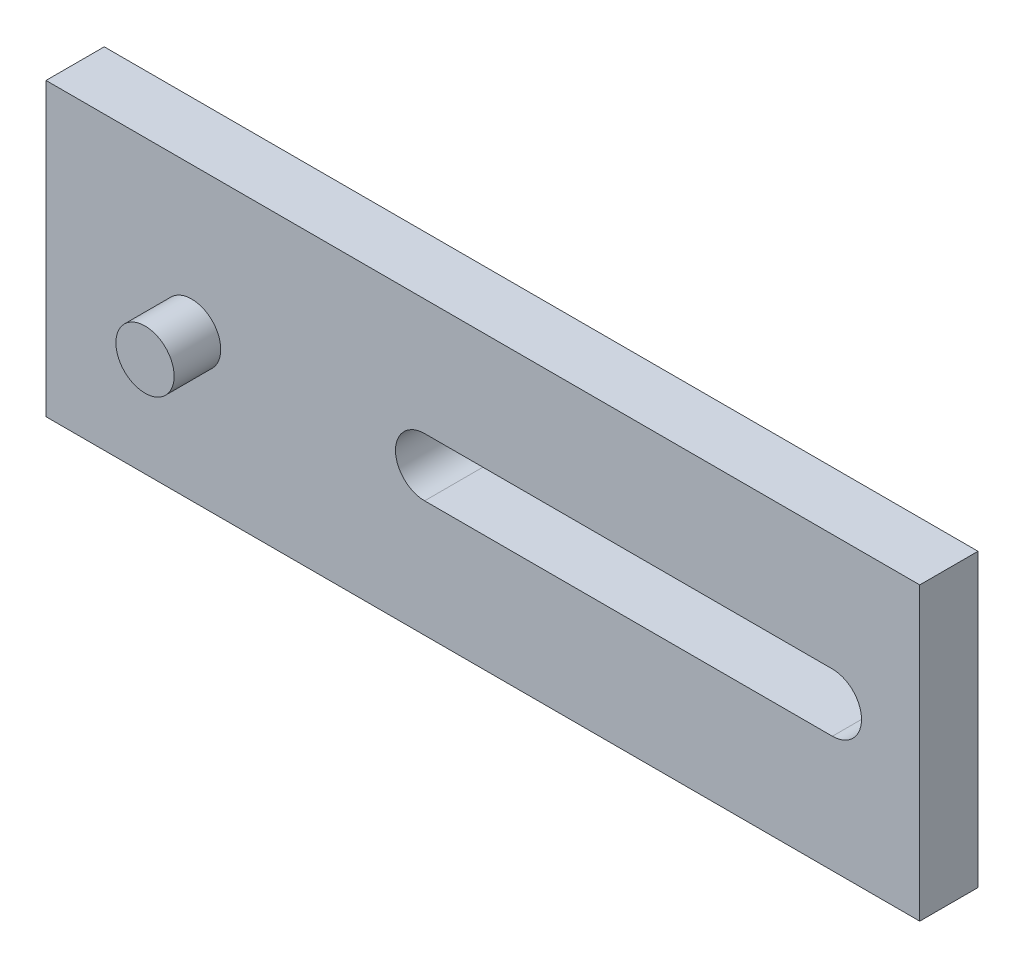
ISO-10303-21;
HEADER;
FILE_DESCRIPTION(('STEP AP214'),'2;1');
FILE_NAME('part.step','',(''),(''),'','','');
FILE_SCHEMA(('AUTOMOTIVE_DESIGN { 1 0 10303 214 1 1 1 1 }'));
ENDSEC;
DATA;
#1=APPLICATION_CONTEXT('core data for automotive mechanical design processes');
#2=APPLICATION_PROTOCOL_DEFINITION('international standard','automotive_design',2000,#1);
#3=PRODUCT_CONTEXT('',#1,'mechanical');
#4=PRODUCT('Part','Part','',(#3));
#5=PRODUCT_RELATED_PRODUCT_CATEGORY('part','',(#4));
#6=PRODUCT_DEFINITION_FORMATION('','',#4);
#7=PRODUCT_DEFINITION_CONTEXT('part definition',#1,'design');
#8=PRODUCT_DEFINITION('design','',#6,#7);
#9=PRODUCT_DEFINITION_SHAPE('','',#8);
#10=(LENGTH_UNIT() NAMED_UNIT(*) SI_UNIT(.MILLI.,.METRE.));
#11=(NAMED_UNIT(*) PLANE_ANGLE_UNIT() SI_UNIT($,.RADIAN.));
#12=(NAMED_UNIT(*) SI_UNIT($,.STERADIAN.) SOLID_ANGLE_UNIT());
#13=UNCERTAINTY_MEASURE_WITH_UNIT(LENGTH_MEASURE(1.E-05),#10,'distance_accuracy_value','');
#14=(GEOMETRIC_REPRESENTATION_CONTEXT(3) GLOBAL_UNCERTAINTY_ASSIGNED_CONTEXT((#13)) GLOBAL_UNIT_ASSIGNED_CONTEXT((#10,
#11,#12)) REPRESENTATION_CONTEXT('',''));
#15=CARTESIAN_POINT('',(0.,0.,0.));
#16=DIRECTION('',(0.,0.,1.));
#17=DIRECTION('',(1.,0.,0.));
#18=AXIS2_PLACEMENT_3D('',#15,#16,#17);
#19=CARTESIAN_POINT('',(0.,0.,10.));
#20=DIRECTION('',(0.,0.,1.));
#21=DIRECTION('',(1.,0.,0.));
#22=AXIS2_PLACEMENT_3D('',#19,#20,#21);
#23=PLANE('',#22);
#24=CARTESIAN_POINT('',(-50.,0.,10.));
#25=DIRECTION('',(0.,0.,1.));
#26=DIRECTION('',(1.,0.,0.));
#27=AXIS2_PLACEMENT_3D('',#24,#25,#26);
#28=CIRCLE('',#27,5.);
#29=CARTESIAN_POINT('',(-45.,0.,10.));
#30=VERTEX_POINT('',#29);
#31=EDGE_CURVE('E11',#30,#30,#28,.T.);
#32=ORIENTED_EDGE('',*,*,#31,.F.);
#33=EDGE_LOOP('',(#32));
#34=FACE_BOUND('',#33,.T.);
#35=DIRECTION('',(0.,-1.,0.));
#36=VECTOR('',#35,1.);
#37=CARTESIAN_POINT('',(-75.,-25.,10.));
#38=LINE('',#37,#36);
#39=CARTESIAN_POINT('',(-75.,25.,10.));
#40=VERTEX_POINT('',#39);
#41=CARTESIAN_POINT('',(-75.,-25.,10.));
#42=VERTEX_POINT('',#41);
#43=EDGE_CURVE('E155',#40,#42,#38,.T.);
#44=ORIENTED_EDGE('',*,*,#43,.T.);
#45=DIRECTION('',(1.,0.,0.));
#46=VECTOR('',#45,1.);
#47=CARTESIAN_POINT('',(75.,-25.,10.));
#48=LINE('',#47,#46);
#49=CARTESIAN_POINT('',(75.,-25.,10.));
#50=VERTEX_POINT('',#49);
#51=EDGE_CURVE('E159',#42,#50,#48,.T.);
#52=ORIENTED_EDGE('',*,*,#51,.T.);
#53=DIRECTION('',(0.,1.,0.));
#54=VECTOR('',#53,1.);
#55=CARTESIAN_POINT('',(75.,-25.,10.));
#56=LINE('',#55,#54);
#57=CARTESIAN_POINT('',(75.,25.,10.));
#58=VERTEX_POINT('',#57);
#59=EDGE_CURVE('E163',#50,#58,#56,.T.);
#60=ORIENTED_EDGE('',*,*,#59,.T.);
#61=DIRECTION('',(-1.,0.,0.));
#62=VECTOR('',#61,1.);
#63=CARTESIAN_POINT('',(75.,25.,10.));
#64=LINE('',#63,#62);
#65=EDGE_CURVE('E166',#58,#40,#64,.T.);
#66=ORIENTED_EDGE('',*,*,#65,.T.);
#67=EDGE_LOOP('',(#44,#52,#60,#66));
#68=FACE_BOUND('',#67,.T.);
#69=DIRECTION('',(-1.,0.,0.));
#70=VECTOR('',#69,1.);
#71=CARTESIAN_POINT('',(60.,5.,10.));
#72=LINE('',#71,#70);
#73=CARTESIAN_POINT('',(60.,5.,10.));
#74=VERTEX_POINT('',#73);
#75=CARTESIAN_POINT('',(-10.,5.00000000000001,10.));
#76=VERTEX_POINT('',#75);
#77=EDGE_CURVE('E115',#74,#76,#72,.T.);
#78=ORIENTED_EDGE('',*,*,#77,.F.);
#79=CARTESIAN_POINT('',(60.,0.,10.));
#80=DIRECTION('',(0.,0.,1.));
#81=DIRECTION('',(1.,0.,0.));
#82=AXIS2_PLACEMENT_3D('',#79,#80,#81);
#83=CIRCLE('',#82,5.);
#84=CARTESIAN_POINT('',(60.,-5.,10.));
#85=VERTEX_POINT('',#84);
#86=EDGE_CURVE('E106',#85,#74,#83,.T.);
#87=ORIENTED_EDGE('',*,*,#86,.F.);
#88=DIRECTION('',(1.,0.,0.));
#89=VECTOR('',#88,1.);
#90=CARTESIAN_POINT('',(-10.,-4.99999999999999,10.));
#91=LINE('',#90,#89);
#92=CARTESIAN_POINT('',(-10.,-4.99999999999999,10.));
#93=VERTEX_POINT('',#92);
#94=EDGE_CURVE('E132',#93,#85,#91,.T.);
#95=ORIENTED_EDGE('',*,*,#94,.F.);
#96=CARTESIAN_POINT('',(-10.,0.,10.));
#97=DIRECTION('',(0.,0.,1.));
#98=DIRECTION('',(1.,0.,0.));
#99=AXIS2_PLACEMENT_3D('',#96,#97,#98);
#100=CIRCLE('',#99,5.);
#101=EDGE_CURVE('E128',#76,#93,#100,.T.);
#102=ORIENTED_EDGE('',*,*,#101,.F.);
#103=EDGE_LOOP('',(#78,#87,#95,#102));
#104=FACE_BOUND('',#103,.T.);
#105=ADVANCED_FACE('F39',(#34,#68,#104),#23,.T.);
#106=CARTESIAN_POINT('',(0.,0.,0.));
#107=DIRECTION('',(0.,0.,1.));
#108=DIRECTION('',(1.,0.,0.));
#109=AXIS2_PLACEMENT_3D('',#106,#107,#108);
#110=PLANE('',#109);
#111=DIRECTION('',(0.,-1.,0.));
#112=VECTOR('',#111,1.);
#113=CARTESIAN_POINT('',(-75.,-25.,0.));
#114=LINE('',#113,#112);
#115=CARTESIAN_POINT('',(-75.,25.,0.));
#116=VERTEX_POINT('',#115);
#117=CARTESIAN_POINT('',(-75.,-25.,0.));
#118=VERTEX_POINT('',#117);
#119=EDGE_CURVE('E124',#116,#118,#114,.T.);
#120=ORIENTED_EDGE('',*,*,#119,.F.);
#121=DIRECTION('',(-1.,0.,0.));
#122=VECTOR('',#121,1.);
#123=CARTESIAN_POINT('',(75.,25.,0.));
#124=LINE('',#123,#122);
#125=CARTESIAN_POINT('',(75.,25.,0.));
#126=VERTEX_POINT('',#125);
#127=EDGE_CURVE('E160',#126,#116,#124,.T.);
#128=ORIENTED_EDGE('',*,*,#127,.F.);
#129=DIRECTION('',(0.,1.,0.));
#130=VECTOR('',#129,1.);
#131=CARTESIAN_POINT('',(75.,-25.,0.));
#132=LINE('',#131,#130);
#133=CARTESIAN_POINT('',(75.,-25.,0.));
#134=VERTEX_POINT('',#133);
#135=EDGE_CURVE('E176',#134,#126,#132,.T.);
#136=ORIENTED_EDGE('',*,*,#135,.F.);
#137=DIRECTION('',(1.,0.,0.));
#138=VECTOR('',#137,1.);
#139=CARTESIAN_POINT('',(75.,-25.,0.));
#140=LINE('',#139,#138);
#141=EDGE_CURVE('E173',#118,#134,#140,.T.);
#142=ORIENTED_EDGE('',*,*,#141,.F.);
#143=EDGE_LOOP('',(#120,#128,#136,#142));
#144=FACE_BOUND('',#143,.T.);
#145=CARTESIAN_POINT('',(60.,0.,0.));
#146=DIRECTION('',(0.,0.,1.));
#147=DIRECTION('',(1.,0.,0.));
#148=AXIS2_PLACEMENT_3D('',#145,#146,#147);
#149=CIRCLE('',#148,5.);
#150=CARTESIAN_POINT('',(60.,-5.,0.));
#151=VERTEX_POINT('',#150);
#152=CARTESIAN_POINT('',(60.,5.,0.));
#153=VERTEX_POINT('',#152);
#154=EDGE_CURVE('E64',#151,#153,#149,.T.);
#155=ORIENTED_EDGE('',*,*,#154,.T.);
#156=DIRECTION('',(-1.,0.,0.));
#157=VECTOR('',#156,1.);
#158=CARTESIAN_POINT('',(60.,5.,0.));
#159=LINE('',#158,#157);
#160=CARTESIAN_POINT('',(-10.,5.00000000000001,0.));
#161=VERTEX_POINT('',#160);
#162=EDGE_CURVE('E122',#153,#161,#159,.T.);
#163=ORIENTED_EDGE('',*,*,#162,.T.);
#164=CARTESIAN_POINT('',(-10.,0.,0.));
#165=DIRECTION('',(0.,0.,1.));
#166=DIRECTION('',(1.,0.,0.));
#167=AXIS2_PLACEMENT_3D('',#164,#165,#166);
#168=CIRCLE('',#167,5.);
#169=CARTESIAN_POINT('',(-10.,-4.99999999999999,0.));
#170=VERTEX_POINT('',#169);
#171=EDGE_CURVE('E142',#161,#170,#168,.T.);
#172=ORIENTED_EDGE('',*,*,#171,.T.);
#173=DIRECTION('',(1.,0.,0.));
#174=VECTOR('',#173,1.);
#175=CARTESIAN_POINT('',(-10.,-4.99999999999999,0.));
#176=LINE('',#175,#174);
#177=EDGE_CURVE('E116',#170,#151,#176,.T.);
#178=ORIENTED_EDGE('',*,*,#177,.T.);
#179=EDGE_LOOP('',(#155,#163,#172,#178));
#180=FACE_BOUND('',#179,.T.);
#181=ADVANCED_FACE('F205',(#144,#180),#110,.F.);
#182=CARTESIAN_POINT('',(-75.,-25.,10.));
#183=DIRECTION('',(1.,0.,0.));
#184=DIRECTION('',(0.,0.,-1.));
#185=AXIS2_PLACEMENT_3D('',#182,#183,#184);
#186=PLANE('',#185);
#187=ORIENTED_EDGE('',*,*,#119,.T.);
#188=DIRECTION('',(0.,0.,-1.));
#189=VECTOR('',#188,1.);
#190=CARTESIAN_POINT('',(-75.,-25.,10.));
#191=LINE('',#190,#189);
#192=EDGE_CURVE('E43',#42,#118,#191,.T.);
#193=ORIENTED_EDGE('',*,*,#192,.F.);
#194=ORIENTED_EDGE('',*,*,#43,.F.);
#195=DIRECTION('',(0.,0.,-1.));
#196=VECTOR('',#195,1.);
#197=CARTESIAN_POINT('',(-75.,25.,10.));
#198=LINE('',#197,#196);
#199=EDGE_CURVE('E169',#40,#116,#198,.T.);
#200=ORIENTED_EDGE('',*,*,#199,.T.);
#201=EDGE_LOOP('',(#187,#193,#194,#200));
#202=FACE_BOUND('',#201,.T.);
#203=ADVANCED_FACE('F41',(#202),#186,.F.);
#204=CARTESIAN_POINT('',(75.,-25.,10.));
#205=DIRECTION('',(0.,1.,0.));
#206=DIRECTION('',(-1.,0.,0.));
#207=AXIS2_PLACEMENT_3D('',#204,#205,#206);
#208=PLANE('',#207);
#209=ORIENTED_EDGE('',*,*,#141,.T.);
#210=DIRECTION('',(0.,0.,-1.));
#211=VECTOR('',#210,1.);
#212=CARTESIAN_POINT('',(75.,-25.,10.));
#213=LINE('',#212,#211);
#214=EDGE_CURVE('E187',#50,#134,#213,.T.);
#215=ORIENTED_EDGE('',*,*,#214,.F.);
#216=ORIENTED_EDGE('',*,*,#51,.F.);
#217=ORIENTED_EDGE('',*,*,#192,.T.);
#218=EDGE_LOOP('',(#209,#215,#216,#217));
#219=FACE_BOUND('',#218,.T.);
#220=ADVANCED_FACE('F198',(#219),#208,.F.);
#221=CARTESIAN_POINT('',(75.,-25.,10.));
#222=DIRECTION('',(-1.,0.,0.));
#223=DIRECTION('',(0.,0.,1.));
#224=AXIS2_PLACEMENT_3D('',#221,#222,#223);
#225=PLANE('',#224);
#226=ORIENTED_EDGE('',*,*,#135,.T.);
#227=DIRECTION('',(0.,0.,-1.));
#228=VECTOR('',#227,1.);
#229=CARTESIAN_POINT('',(75.,25.,10.));
#230=LINE('',#229,#228);
#231=EDGE_CURVE('E184',#58,#126,#230,.T.);
#232=ORIENTED_EDGE('',*,*,#231,.F.);
#233=ORIENTED_EDGE('',*,*,#59,.F.);
#234=ORIENTED_EDGE('',*,*,#214,.T.);
#235=EDGE_LOOP('',(#226,#232,#233,#234));
#236=FACE_BOUND('',#235,.T.);
#237=ADVANCED_FACE('F208',(#236),#225,.F.);
#238=CARTESIAN_POINT('',(75.,25.,10.));
#239=DIRECTION('',(0.,-1.,0.));
#240=DIRECTION('',(1.,0.,0.));
#241=AXIS2_PLACEMENT_3D('',#238,#239,#240);
#242=PLANE('',#241);
#243=ORIENTED_EDGE('',*,*,#127,.T.);
#244=ORIENTED_EDGE('',*,*,#199,.F.);
#245=ORIENTED_EDGE('',*,*,#65,.F.);
#246=ORIENTED_EDGE('',*,*,#231,.T.);
#247=EDGE_LOOP('',(#243,#244,#245,#246));
#248=FACE_BOUND('',#247,.T.);
#249=ADVANCED_FACE('F211',(#248),#242,.F.);
#250=CARTESIAN_POINT('',(60.,0.,10.));
#251=DIRECTION('',(0.,0.,-1.));
#252=DIRECTION('',(-1.,0.,0.));
#253=AXIS2_PLACEMENT_3D('',#250,#251,#252);
#254=CYLINDRICAL_SURFACE('',#253,5.);
#255=ORIENTED_EDGE('',*,*,#154,.F.);
#256=DIRECTION('',(0.,0.,-1.));
#257=VECTOR('',#256,1.);
#258=CARTESIAN_POINT('',(60.,-5.,10.));
#259=LINE('',#258,#257);
#260=EDGE_CURVE('E110',#85,#151,#259,.T.);
#261=ORIENTED_EDGE('',*,*,#260,.F.);
#262=ORIENTED_EDGE('',*,*,#86,.T.);
#263=DIRECTION('',(0.,0.,-1.));
#264=VECTOR('',#263,1.);
#265=CARTESIAN_POINT('',(60.,5.,10.));
#266=LINE('',#265,#264);
#267=EDGE_CURVE('E109',#74,#153,#266,.T.);
#268=ORIENTED_EDGE('',*,*,#267,.T.);
#269=EDGE_LOOP('',(#255,#261,#262,#268));
#270=FACE_BOUND('',#269,.T.);
#271=ADVANCED_FACE('F108',(#270),#254,.F.);
#272=CARTESIAN_POINT('',(60.,5.,10.));
#273=DIRECTION('',(0.,-1.,0.));
#274=DIRECTION('',(1.,0.,0.));
#275=AXIS2_PLACEMENT_3D('',#272,#273,#274);
#276=PLANE('',#275);
#277=ORIENTED_EDGE('',*,*,#162,.F.);
#278=ORIENTED_EDGE('',*,*,#267,.F.);
#279=ORIENTED_EDGE('',*,*,#77,.T.);
#280=DIRECTION('',(0.,0.,-1.));
#281=VECTOR('',#280,1.);
#282=CARTESIAN_POINT('',(-10.,5.00000000000001,10.));
#283=LINE('',#282,#281);
#284=EDGE_CURVE('E125',#76,#161,#283,.T.);
#285=ORIENTED_EDGE('',*,*,#284,.T.);
#286=EDGE_LOOP('',(#277,#278,#279,#285));
#287=FACE_BOUND('',#286,.T.);
#288=ADVANCED_FACE('F119',(#287),#276,.T.);
#289=CARTESIAN_POINT('',(-10.,0.,10.));
#290=DIRECTION('',(0.,0.,-1.));
#291=DIRECTION('',(-1.,0.,0.));
#292=AXIS2_PLACEMENT_3D('',#289,#290,#291);
#293=CYLINDRICAL_SURFACE('',#292,5.);
#294=ORIENTED_EDGE('',*,*,#171,.F.);
#295=ORIENTED_EDGE('',*,*,#284,.F.);
#296=ORIENTED_EDGE('',*,*,#101,.T.);
#297=DIRECTION('',(0.,0.,-1.));
#298=VECTOR('',#297,1.);
#299=CARTESIAN_POINT('',(-10.,-4.99999999999999,10.));
#300=LINE('',#299,#298);
#301=EDGE_CURVE('E56',#93,#170,#300,.T.);
#302=ORIENTED_EDGE('',*,*,#301,.T.);
#303=EDGE_LOOP('',(#294,#295,#296,#302));
#304=FACE_BOUND('',#303,.T.);
#305=ADVANCED_FACE('F272',(#304),#293,.F.);
#306=CARTESIAN_POINT('',(-10.,-4.99999999999999,10.));
#307=DIRECTION('',(0.,1.,0.));
#308=DIRECTION('',(-1.,0.,0.));
#309=AXIS2_PLACEMENT_3D('',#306,#307,#308);
#310=PLANE('',#309);
#311=ORIENTED_EDGE('',*,*,#177,.F.);
#312=ORIENTED_EDGE('',*,*,#301,.F.);
#313=ORIENTED_EDGE('',*,*,#94,.T.);
#314=ORIENTED_EDGE('',*,*,#260,.T.);
#315=EDGE_LOOP('',(#311,#312,#313,#314));
#316=FACE_BOUND('',#315,.T.);
#317=ADVANCED_FACE('F279',(#316),#310,.T.);
#318=CARTESIAN_POINT('',(-50.,0.,18.));
#319=DIRECTION('',(0.,0.,-1.));
#320=DIRECTION('',(-1.,0.,0.));
#321=AXIS2_PLACEMENT_3D('',#318,#319,#320);
#322=CYLINDRICAL_SURFACE('',#321,5.);
#323=CARTESIAN_POINT('',(-50.,0.,18.));
#324=DIRECTION('',(0.,0.,1.));
#325=DIRECTION('',(1.,0.,0.));
#326=AXIS2_PLACEMENT_3D('',#323,#324,#325);
#327=CIRCLE('',#326,5.);
#328=CARTESIAN_POINT('',(-45.,0.,18.));
#329=VERTEX_POINT('',#328);
#330=EDGE_CURVE('E139',#329,#329,#327,.T.);
#331=ORIENTED_EDGE('',*,*,#330,.F.);
#332=EDGE_LOOP('',(#331));
#333=FACE_BOUND('',#332,.T.);
#334=ORIENTED_EDGE('',*,*,#31,.T.);
#335=EDGE_LOOP('',(#334));
#336=FACE_BOUND('',#335,.T.);
#337=ADVANCED_FACE('F288',(#333,#336),#322,.T.);
#338=CARTESIAN_POINT('',(-50.,0.,18.));
#339=DIRECTION('',(0.,0.,1.));
#340=DIRECTION('',(1.,0.,0.));
#341=AXIS2_PLACEMENT_3D('',#338,#339,#340);
#342=PLANE('',#341);
#343=ORIENTED_EDGE('',*,*,#330,.T.);
#344=EDGE_LOOP('',(#343));
#345=FACE_BOUND('',#344,.T.);
#346=ADVANCED_FACE('F296',(#345),#342,.T.);
#347=CLOSED_SHELL('',(#105,#181,#203,#220,#237,#249,#271,#288,#305,#317,#337,#346));
#348=MANIFOLD_SOLID_BREP('B2',#347);
#349=ADVANCED_BREP_SHAPE_REPRESENTATION('',(#18,#348),#14);
#350=SHAPE_DEFINITION_REPRESENTATION(#9,#349);
ENDSEC;
END-ISO-10303-21;
